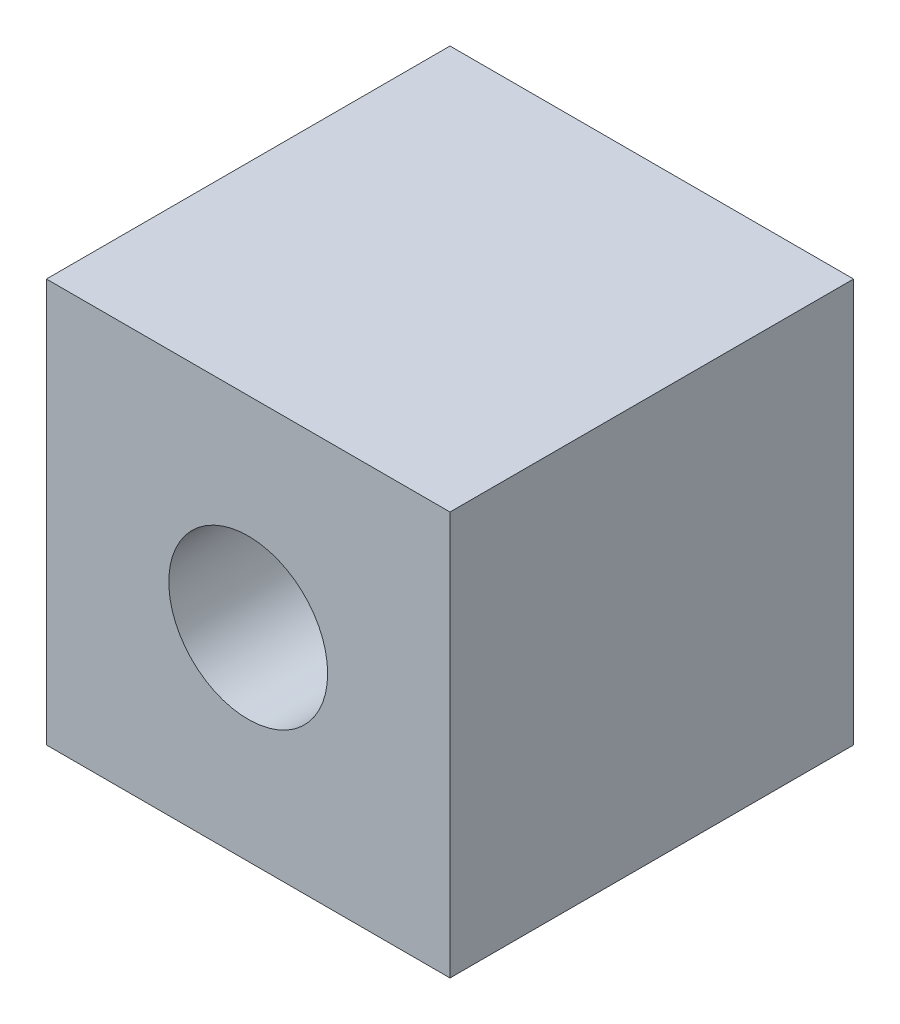
ISO-10303-21;
HEADER;
FILE_DESCRIPTION(('STEP AP214'),'2;1');
FILE_NAME('part.step','',(''),(''),'','','');
FILE_SCHEMA(('AUTOMOTIVE_DESIGN { 1 0 10303 214 1 1 1 1 }'));
ENDSEC;
DATA;
#1=APPLICATION_CONTEXT('core data for automotive mechanical design processes');
#2=APPLICATION_PROTOCOL_DEFINITION('international standard','automotive_design',2000,#1);
#3=PRODUCT_CONTEXT('',#1,'mechanical');
#4=PRODUCT('Part','Part','',(#3));
#5=PRODUCT_RELATED_PRODUCT_CATEGORY('part','',(#4));
#6=PRODUCT_DEFINITION_FORMATION('','',#4);
#7=PRODUCT_DEFINITION_CONTEXT('part definition',#1,'design');
#8=PRODUCT_DEFINITION('design','',#6,#7);
#9=PRODUCT_DEFINITION_SHAPE('','',#8);
#10=(LENGTH_UNIT() NAMED_UNIT(*) SI_UNIT(.MILLI.,.METRE.));
#11=(NAMED_UNIT(*) PLANE_ANGLE_UNIT() SI_UNIT($,.RADIAN.));
#12=(NAMED_UNIT(*) SI_UNIT($,.STERADIAN.) SOLID_ANGLE_UNIT());
#13=UNCERTAINTY_MEASURE_WITH_UNIT(LENGTH_MEASURE(1.E-05),#10,'distance_accuracy_value','');
#14=(GEOMETRIC_REPRESENTATION_CONTEXT(3) GLOBAL_UNCERTAINTY_ASSIGNED_CONTEXT((#13)) GLOBAL_UNIT_ASSIGNED_CONTEXT((#10,
#11,#12)) REPRESENTATION_CONTEXT('',''));
#15=CARTESIAN_POINT('',(0.,0.,0.));
#16=DIRECTION('',(0.,0.,1.));
#17=DIRECTION('',(1.,0.,0.));
#18=AXIS2_PLACEMENT_3D('',#15,#16,#17);
#19=CARTESIAN_POINT('',(6.35,12.7,6.35));
#20=DIRECTION('',(-1.,0.,0.));
#21=DIRECTION('',(0.,0.,1.));
#22=AXIS2_PLACEMENT_3D('',#19,#20,#21);
#23=PLANE('',#22);
#24=DIRECTION('',(0.,0.,-1.));
#25=VECTOR('',#24,1.);
#26=CARTESIAN_POINT('',(6.35,0.,6.35));
#27=LINE('',#26,#25);
#28=CARTESIAN_POINT('',(6.35,0.,6.35));
#29=VERTEX_POINT('',#28);
#30=CARTESIAN_POINT('',(6.35,0.,-6.35));
#31=VERTEX_POINT('',#30);
#32=EDGE_CURVE('E102',#29,#31,#27,.T.);
#33=ORIENTED_EDGE('',*,*,#32,.T.);
#34=DIRECTION('',(0.,-1.,0.));
#35=VECTOR('',#34,1.);
#36=CARTESIAN_POINT('',(6.35,12.7,-6.35));
#37=LINE('',#36,#35);
#38=CARTESIAN_POINT('',(6.35,12.7,-6.35));
#39=VERTEX_POINT('',#38);
#40=EDGE_CURVE('E11',#39,#31,#37,.T.);
#41=ORIENTED_EDGE('',*,*,#40,.F.);
#42=DIRECTION('',(0.,0.,-1.));
#43=VECTOR('',#42,1.);
#44=CARTESIAN_POINT('',(6.35,12.7,6.35));
#45=LINE('',#44,#43);
#46=CARTESIAN_POINT('',(6.35,12.7,6.35));
#47=VERTEX_POINT('',#46);
#48=EDGE_CURVE('E90',#47,#39,#45,.T.);
#49=ORIENTED_EDGE('',*,*,#48,.F.);
#50=DIRECTION('',(0.,-1.,0.));
#51=VECTOR('',#50,1.);
#52=CARTESIAN_POINT('',(6.35,12.7,6.35));
#53=LINE('',#52,#51);
#54=EDGE_CURVE('E98',#47,#29,#53,.T.);
#55=ORIENTED_EDGE('',*,*,#54,.T.);
#56=EDGE_LOOP('',(#33,#41,#49,#55));
#57=FACE_BOUND('',#56,.T.);
#58=ADVANCED_FACE('F39',(#57),#23,.F.);
#59=CARTESIAN_POINT('',(-6.35,12.7,-6.35));
#60=DIRECTION('',(0.,0.,1.));
#61=DIRECTION('',(1.,0.,0.));
#62=AXIS2_PLACEMENT_3D('',#59,#60,#61);
#63=PLANE('',#62);
#64=DIRECTION('',(-1.,0.,0.));
#65=VECTOR('',#64,1.);
#66=CARTESIAN_POINT('',(-6.35,0.,-6.35));
#67=LINE('',#66,#65);
#68=CARTESIAN_POINT('',(-6.35,0.,-6.35));
#69=VERTEX_POINT('',#68);
#70=EDGE_CURVE('E94',#31,#69,#67,.T.);
#71=ORIENTED_EDGE('',*,*,#70,.T.);
#72=DIRECTION('',(0.,-1.,0.));
#73=VECTOR('',#72,1.);
#74=CARTESIAN_POINT('',(-6.35,12.7,-6.35));
#75=LINE('',#74,#73);
#76=CARTESIAN_POINT('',(-6.35,12.7,-6.35));
#77=VERTEX_POINT('',#76);
#78=EDGE_CURVE('E47',#77,#69,#75,.T.);
#79=ORIENTED_EDGE('',*,*,#78,.F.);
#80=DIRECTION('',(-1.,0.,0.));
#81=VECTOR('',#80,1.);
#82=CARTESIAN_POINT('',(-6.35,12.7,-6.35));
#83=LINE('',#82,#81);
#84=EDGE_CURVE('E85',#39,#77,#83,.T.);
#85=ORIENTED_EDGE('',*,*,#84,.F.);
#86=ORIENTED_EDGE('',*,*,#40,.T.);
#87=EDGE_LOOP('',(#71,#79,#85,#86));
#88=FACE_BOUND('',#87,.T.);
#89=ADVANCED_FACE('F93',(#88),#63,.F.);
#90=CARTESIAN_POINT('',(-6.35,12.7,6.35));
#91=DIRECTION('',(1.,0.,0.));
#92=DIRECTION('',(0.,0.,-1.));
#93=AXIS2_PLACEMENT_3D('',#90,#91,#92);
#94=PLANE('',#93);
#95=DIRECTION('',(0.,0.,1.));
#96=VECTOR('',#95,1.);
#97=CARTESIAN_POINT('',(-6.35,0.,6.35));
#98=LINE('',#97,#96);
#99=CARTESIAN_POINT('',(-6.35,0.,6.35));
#100=VERTEX_POINT('',#99);
#101=EDGE_CURVE('E72',#69,#100,#98,.T.);
#102=ORIENTED_EDGE('',*,*,#101,.T.);
#103=DIRECTION('',(0.,-1.,0.));
#104=VECTOR('',#103,1.);
#105=CARTESIAN_POINT('',(-6.35,12.7,6.35));
#106=LINE('',#105,#104);
#107=CARTESIAN_POINT('',(-6.35,12.7,6.35));
#108=VERTEX_POINT('',#107);
#109=EDGE_CURVE('E95',#108,#100,#106,.T.);
#110=ORIENTED_EDGE('',*,*,#109,.F.);
#111=DIRECTION('',(0.,0.,1.));
#112=VECTOR('',#111,1.);
#113=CARTESIAN_POINT('',(-6.35,12.7,6.35));
#114=LINE('',#113,#112);
#115=EDGE_CURVE('E88',#77,#108,#114,.T.);
#116=ORIENTED_EDGE('',*,*,#115,.F.);
#117=ORIENTED_EDGE('',*,*,#78,.T.);
#118=EDGE_LOOP('',(#102,#110,#116,#117));
#119=FACE_BOUND('',#118,.T.);
#120=ADVANCED_FACE('F96',(#119),#94,.F.);
#121=CARTESIAN_POINT('',(-6.35,12.7,6.35));
#122=DIRECTION('',(0.,0.,-1.));
#123=DIRECTION('',(-1.,0.,0.));
#124=AXIS2_PLACEMENT_3D('',#121,#122,#123);
#125=PLANE('',#124);
#126=CARTESIAN_POINT('',(0.,6.37349379907112,6.35));
#127=DIRECTION('',(0.,0.,1.));
#128=DIRECTION('',(1.,0.,0.));
#129=AXIS2_PLACEMENT_3D('',#126,#127,#128);
#130=CIRCLE('',#129,2.5);
#131=CARTESIAN_POINT('',(2.5,6.37349379907112,6.35));
#132=VERTEX_POINT('',#131);
#133=EDGE_CURVE('E116',#132,#132,#130,.T.);
#134=ORIENTED_EDGE('',*,*,#133,.F.);
#135=EDGE_LOOP('',(#134));
#136=FACE_BOUND('',#135,.T.);
#137=DIRECTION('',(1.,0.,0.));
#138=VECTOR('',#137,1.);
#139=CARTESIAN_POINT('',(-6.35,0.,6.35));
#140=LINE('',#139,#138);
#141=EDGE_CURVE('E78',#100,#29,#140,.T.);
#142=ORIENTED_EDGE('',*,*,#141,.T.);
#143=ORIENTED_EDGE('',*,*,#54,.F.);
#144=DIRECTION('',(1.,0.,0.));
#145=VECTOR('',#144,1.);
#146=CARTESIAN_POINT('',(-6.35,12.7,6.35));
#147=LINE('',#146,#145);
#148=EDGE_CURVE('E55',#108,#47,#147,.T.);
#149=ORIENTED_EDGE('',*,*,#148,.F.);
#150=ORIENTED_EDGE('',*,*,#109,.T.);
#151=EDGE_LOOP('',(#142,#143,#149,#150));
#152=FACE_BOUND('',#151,.T.);
#153=ADVANCED_FACE('F110',(#136,#152),#125,.F.);
#154=CARTESIAN_POINT('',(0.,12.7,0.));
#155=DIRECTION('',(0.,-1.,0.));
#156=DIRECTION('',(0.,0.,-1.));
#157=AXIS2_PLACEMENT_3D('',#154,#155,#156);
#158=PLANE('',#157);
#159=ORIENTED_EDGE('',*,*,#48,.T.);
#160=ORIENTED_EDGE('',*,*,#84,.T.);
#161=ORIENTED_EDGE('',*,*,#115,.T.);
#162=ORIENTED_EDGE('',*,*,#148,.T.);
#163=EDGE_LOOP('',(#159,#160,#161,#162));
#164=FACE_BOUND('',#163,.T.);
#165=ADVANCED_FACE('F86',(#164),#158,.F.);
#166=CARTESIAN_POINT('',(0.,0.,0.));
#167=DIRECTION('',(0.,-1.,0.));
#168=DIRECTION('',(0.,0.,-1.));
#169=AXIS2_PLACEMENT_3D('',#166,#167,#168);
#170=PLANE('',#169);
#171=ORIENTED_EDGE('',*,*,#32,.F.);
#172=ORIENTED_EDGE('',*,*,#141,.F.);
#173=ORIENTED_EDGE('',*,*,#101,.F.);
#174=ORIENTED_EDGE('',*,*,#70,.F.);
#175=EDGE_LOOP('',(#171,#172,#173,#174));
#176=FACE_BOUND('',#175,.T.);
#177=ADVANCED_FACE('F113',(#176),#170,.T.);
#178=CARTESIAN_POINT('',(0.,6.37349379907112,0.));
#179=DIRECTION('',(0.,0.,1.));
#180=DIRECTION('',(1.,0.,0.));
#181=AXIS2_PLACEMENT_3D('',#178,#179,#180);
#182=CYLINDRICAL_SURFACE('',#181,2.5);
#183=CARTESIAN_POINT('',(0.,6.37349379907112,0.));
#184=DIRECTION('',(0.,0.,1.));
#185=DIRECTION('',(1.,0.,0.));
#186=AXIS2_PLACEMENT_3D('',#183,#184,#185);
#187=CIRCLE('',#186,2.5);
#188=CARTESIAN_POINT('',(2.5,6.37349379907112,0.));
#189=VERTEX_POINT('',#188);
#190=EDGE_CURVE('E105',#189,#189,#187,.T.);
#191=ORIENTED_EDGE('',*,*,#190,.F.);
#192=EDGE_LOOP('',(#191));
#193=FACE_BOUND('',#192,.T.);
#194=ORIENTED_EDGE('',*,*,#133,.T.);
#195=EDGE_LOOP('',(#194));
#196=FACE_BOUND('',#195,.T.);
#197=ADVANCED_FACE('F124',(#193,#196),#182,.F.);
#198=CARTESIAN_POINT('',(0.,0.,0.));
#199=DIRECTION('',(0.,0.,1.));
#200=DIRECTION('',(1.,0.,0.));
#201=AXIS2_PLACEMENT_3D('',#198,#199,#200);
#202=PLANE('',#201);
#203=ORIENTED_EDGE('',*,*,#190,.T.);
#204=EDGE_LOOP('',(#203));
#205=FACE_BOUND('',#204,.T.);
#206=ADVANCED_FACE('F122',(#205),#202,.T.);
#207=CLOSED_SHELL('',(#58,#89,#120,#153,#165,#177,#197,#206));
#208=MANIFOLD_SOLID_BREP('B2',#207);
#209=ADVANCED_BREP_SHAPE_REPRESENTATION('',(#18,#208),#14);
#210=SHAPE_DEFINITION_REPRESENTATION(#9,#209);
ENDSEC;
END-ISO-10303-21;
